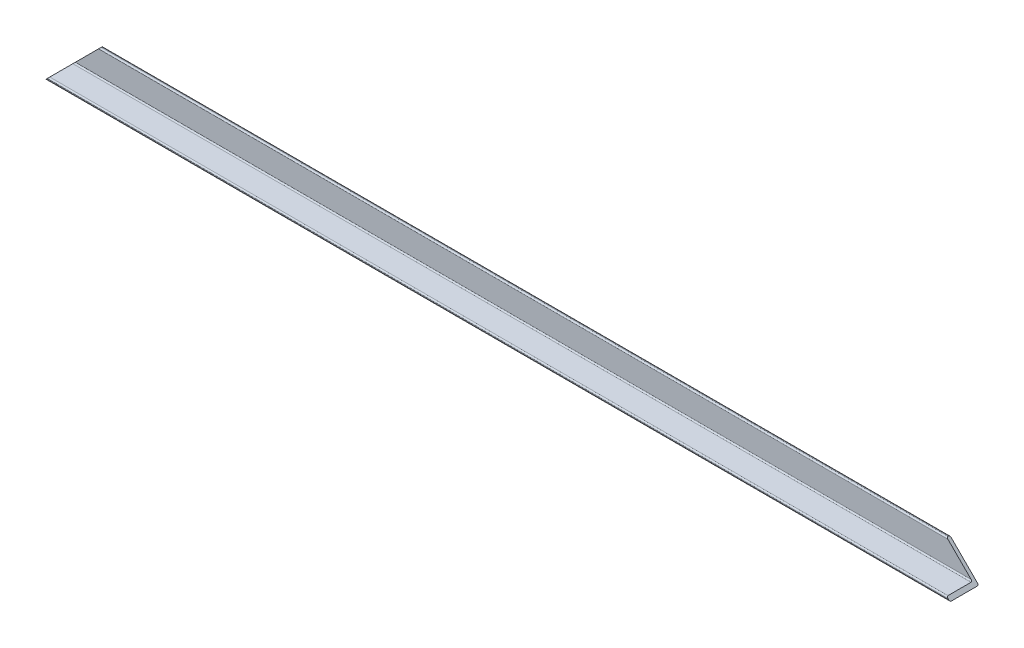
ISO-10303-21;
HEADER;
FILE_DESCRIPTION(('STEP AP214'),'2;1');
FILE_NAME('part.step','',(''),(''),'','','');
FILE_SCHEMA(('AUTOMOTIVE_DESIGN { 1 0 10303 214 1 1 1 1 }'));
ENDSEC;
DATA;
#1=APPLICATION_CONTEXT('core data for automotive mechanical design processes');
#2=APPLICATION_PROTOCOL_DEFINITION('international standard','automotive_design',2000,#1);
#3=PRODUCT_CONTEXT('',#1,'mechanical');
#4=PRODUCT('Part','Part','',(#3));
#5=PRODUCT_RELATED_PRODUCT_CATEGORY('part','',(#4));
#6=PRODUCT_DEFINITION_FORMATION('','',#4);
#7=PRODUCT_DEFINITION_CONTEXT('part definition',#1,'design');
#8=PRODUCT_DEFINITION('design','',#6,#7);
#9=PRODUCT_DEFINITION_SHAPE('','',#8);
#10=(LENGTH_UNIT() NAMED_UNIT(*) SI_UNIT(.MILLI.,.METRE.));
#11=(NAMED_UNIT(*) PLANE_ANGLE_UNIT() SI_UNIT($,.RADIAN.));
#12=(NAMED_UNIT(*) SI_UNIT($,.STERADIAN.) SOLID_ANGLE_UNIT());
#13=UNCERTAINTY_MEASURE_WITH_UNIT(LENGTH_MEASURE(1.E-05),#10,'distance_accuracy_value','');
#14=(GEOMETRIC_REPRESENTATION_CONTEXT(3) GLOBAL_UNCERTAINTY_ASSIGNED_CONTEXT((#13)) GLOBAL_UNIT_ASSIGNED_CONTEXT((#10,
#11,#12)) REPRESENTATION_CONTEXT('',''));
#15=CARTESIAN_POINT('',(0.,0.,0.));
#16=DIRECTION('',(0.,0.,1.));
#17=DIRECTION('',(1.,0.,0.));
#18=AXIS2_PLACEMENT_3D('',#15,#16,#17);
#19=CARTESIAN_POINT('',(-360.,2.5,-11.25));
#20=DIRECTION('',(0.,0.,1.));
#21=DIRECTION('',(1.,0.,0.));
#22=AXIS2_PLACEMENT_3D('',#19,#20,#21);
#23=PLANE('',#22);
#24=DIRECTION('',(-0.707106781186543,0.707106781186552,0.));
#25=VECTOR('',#24,1.);
#26=CARTESIAN_POINT('',(-4.99999999999567,357.5,-11.25));
#27=LINE('',#26,#25);
#28=CARTESIAN_POINT('',(351.5,0.99999999999989,-11.25));
#29=VERTEX_POINT('',#28);
#30=CARTESIAN_POINT('',(331.,21.5,-11.25));
#31=VERTEX_POINT('',#30);
#32=EDGE_CURVE('E126',#29,#31,#27,.T.);
#33=ORIENTED_EDGE('',*,*,#32,.F.);
#34=DIRECTION('',(-1.,0.,0.));
#35=VECTOR('',#34,1.);
#36=CARTESIAN_POINT('',(-360.,1.,-11.25));
#37=LINE('',#36,#35);
#38=CARTESIAN_POINT('',(-351.5,0.999999999999998,-11.25));
#39=VERTEX_POINT('',#38);
#40=EDGE_CURVE('E138',#29,#39,#37,.T.);
#41=ORIENTED_EDGE('',*,*,#40,.T.);
#42=DIRECTION('',(-0.707106781186543,-0.707106781186552,0.));
#43=VECTOR('',#42,1.);
#44=CARTESIAN_POINT('',(-355.,-2.49999999999994,-11.25));
#45=LINE('',#44,#43);
#46=CARTESIAN_POINT('',(-331.,21.5,-11.25));
#47=VERTEX_POINT('',#46);
#48=EDGE_CURVE('E221',#47,#39,#45,.T.);
#49=ORIENTED_EDGE('',*,*,#48,.F.);
#50=DIRECTION('',(-1.,0.,0.));
#51=VECTOR('',#50,1.);
#52=CARTESIAN_POINT('',(330.,21.5,-11.25));
#53=LINE('',#52,#51);
#54=EDGE_CURVE('E141',#47,#31,#53,.F.);
#55=ORIENTED_EDGE('',*,*,#54,.T.);
#56=EDGE_LOOP('',(#33,#41,#49,#55));
#57=FACE_BOUND('',#56,.T.);
#58=ADVANCED_FACE('F33',(#57),#23,.F.);
#59=CARTESIAN_POINT('',(-360.,2.5,11.25));
#60=DIRECTION('',(0.,0.,-1.));
#61=DIRECTION('',(-1.,0.,0.));
#62=AXIS2_PLACEMENT_3D('',#59,#60,#61);
#63=PLANE('',#62);
#64=DIRECTION('',(0.707106781186543,0.707106781186552,0.));
#65=VECTOR('',#64,1.);
#66=CARTESIAN_POINT('',(-360.,-7.5,11.25));
#67=LINE('',#66,#65);
#68=CARTESIAN_POINT('',(-351.5,0.999999999999999,11.25));
#69=VERTEX_POINT('',#68);
#70=CARTESIAN_POINT('',(-351.,1.5,11.25));
#71=VERTEX_POINT('',#70);
#72=EDGE_CURVE('E142',#69,#71,#67,.T.);
#73=ORIENTED_EDGE('',*,*,#72,.F.);
#74=DIRECTION('',(1.,0.,0.));
#75=VECTOR('',#74,1.);
#76=CARTESIAN_POINT('',(-360.,1.,11.25));
#77=LINE('',#76,#75);
#78=CARTESIAN_POINT('',(351.5,0.999999999999999,11.25));
#79=VERTEX_POINT('',#78);
#80=EDGE_CURVE('E171',#69,#79,#77,.T.);
#81=ORIENTED_EDGE('',*,*,#80,.T.);
#82=DIRECTION('',(0.707106781186543,-0.707106781186552,0.));
#83=VECTOR('',#82,1.);
#84=CARTESIAN_POINT('',(360.,-7.5,11.25));
#85=LINE('',#84,#83);
#86=CARTESIAN_POINT('',(351.,1.5,11.25));
#87=VERTEX_POINT('',#86);
#88=EDGE_CURVE('E234',#87,#79,#85,.T.);
#89=ORIENTED_EDGE('',*,*,#88,.F.);
#90=DIRECTION('',(1.,0.,0.));
#91=VECTOR('',#90,1.);
#92=CARTESIAN_POINT('',(-350.,1.5,11.25));
#93=LINE('',#92,#91);
#94=EDGE_CURVE('E133',#87,#71,#93,.F.);
#95=ORIENTED_EDGE('',*,*,#94,.T.);
#96=EDGE_LOOP('',(#73,#81,#89,#95));
#97=FACE_BOUND('',#96,.T.);
#98=ADVANCED_FACE('F241',(#97),#63,.F.);
#99=CARTESIAN_POINT('',(0.,2.5,0.));
#100=DIRECTION('',(0.,1.,0.));
#101=DIRECTION('',(0.,0.,1.));
#102=AXIS2_PLACEMENT_3D('',#99,#100,#101);
#103=PLANE('',#102);
#104=DIRECTION('',(0.,0.,1.));
#105=VECTOR('',#104,1.);
#106=CARTESIAN_POINT('',(-350.,2.5,0.));
#107=LINE('',#106,#105);
#108=CARTESIAN_POINT('',(-350.,2.5,-7.75));
#109=VERTEX_POINT('',#108);
#110=CARTESIAN_POINT('',(-350.,2.5,10.25));
#111=VERTEX_POINT('',#110);
#112=EDGE_CURVE('E209',#109,#111,#107,.T.);
#113=ORIENTED_EDGE('',*,*,#112,.T.);
#114=DIRECTION('',(1.,0.,0.));
#115=VECTOR('',#114,1.);
#116=CARTESIAN_POINT('',(350.,2.5,10.25));
#117=LINE('',#116,#115);
#118=CARTESIAN_POINT('',(350.,2.5,10.25));
#119=VERTEX_POINT('',#118);
#120=EDGE_CURVE('E175',#111,#119,#117,.T.);
#121=ORIENTED_EDGE('',*,*,#120,.T.);
#122=DIRECTION('',(0.,0.,-1.));
#123=VECTOR('',#122,1.);
#124=CARTESIAN_POINT('',(350.,2.5,0.));
#125=LINE('',#124,#123);
#126=CARTESIAN_POINT('',(350.,2.5,-7.75));
#127=VERTEX_POINT('',#126);
#128=EDGE_CURVE('E190',#119,#127,#125,.T.);
#129=ORIENTED_EDGE('',*,*,#128,.T.);
#130=DIRECTION('',(1.,0.,0.));
#131=VECTOR('',#130,1.);
#132=CARTESIAN_POINT('',(0.,2.5,-7.75));
#133=LINE('',#132,#131);
#134=EDGE_CURVE('E173',#127,#109,#133,.F.);
#135=ORIENTED_EDGE('',*,*,#134,.T.);
#136=EDGE_LOOP('',(#113,#121,#129,#135));
#137=FACE_BOUND('',#136,.T.);
#138=ADVANCED_FACE('F198',(#137),#103,.T.);
#139=CARTESIAN_POINT('',(0.,0.,0.));
#140=DIRECTION('',(0.,1.,0.));
#141=DIRECTION('',(0.,0.,1.));
#142=AXIS2_PLACEMENT_3D('',#139,#140,#141);
#143=PLANE('',#142);
#144=DIRECTION('',(0.,0.,1.));
#145=VECTOR('',#144,1.);
#146=CARTESIAN_POINT('',(-352.5,0.,0.));
#147=LINE('',#146,#145);
#148=CARTESIAN_POINT('',(-352.5,0.,-10.25));
#149=VERTEX_POINT('',#148);
#150=CARTESIAN_POINT('',(-352.5,0.,10.25));
#151=VERTEX_POINT('',#150);
#152=EDGE_CURVE('E214',#149,#151,#147,.T.);
#153=ORIENTED_EDGE('',*,*,#152,.F.);
#154=DIRECTION('',(-1.,0.,0.));
#155=VECTOR('',#154,1.);
#156=CARTESIAN_POINT('',(0.,0.,-10.25));
#157=LINE('',#156,#155);
#158=CARTESIAN_POINT('',(352.5,0.,-10.25));
#159=VERTEX_POINT('',#158);
#160=EDGE_CURVE('E162',#149,#159,#157,.F.);
#161=ORIENTED_EDGE('',*,*,#160,.T.);
#162=DIRECTION('',(0.,0.,-1.));
#163=VECTOR('',#162,1.);
#164=CARTESIAN_POINT('',(352.5,0.,0.));
#165=LINE('',#164,#163);
#166=CARTESIAN_POINT('',(352.5,0.,10.25));
#167=VERTEX_POINT('',#166);
#168=EDGE_CURVE('E129',#167,#159,#165,.T.);
#169=ORIENTED_EDGE('',*,*,#168,.F.);
#170=DIRECTION('',(1.,0.,0.));
#171=VECTOR('',#170,1.);
#172=CARTESIAN_POINT('',(0.,0.,10.25));
#173=LINE('',#172,#171);
#174=EDGE_CURVE('E160',#167,#151,#173,.F.);
#175=ORIENTED_EDGE('',*,*,#174,.T.);
#176=EDGE_LOOP('',(#153,#161,#169,#175));
#177=FACE_BOUND('',#176,.T.);
#178=ADVANCED_FACE('F249',(#177),#143,.F.);
#179=CARTESIAN_POINT('',(-360.,22.5,-8.75));
#180=DIRECTION('',(0.,0.,-1.));
#181=DIRECTION('',(-1.,0.,0.));
#182=AXIS2_PLACEMENT_3D('',#179,#180,#181);
#183=PLANE('',#182);
#184=DIRECTION('',(0.707106781186543,-0.707106781186552,0.));
#185=VECTOR('',#184,1.);
#186=CARTESIAN_POINT('',(-14.9999999999957,367.5,-8.75));
#187=LINE('',#186,#185);
#188=CARTESIAN_POINT('',(331.,21.5,-8.75));
#189=VERTEX_POINT('',#188);
#190=CARTESIAN_POINT('',(349.,3.49999999999995,-8.75));
#191=VERTEX_POINT('',#190);
#192=EDGE_CURVE('E192',#189,#191,#187,.T.);
#193=ORIENTED_EDGE('',*,*,#192,.F.);
#194=DIRECTION('',(1.,0.,0.));
#195=VECTOR('',#194,1.);
#196=CARTESIAN_POINT('',(-330.,21.5,-8.75));
#197=LINE('',#196,#195);
#198=CARTESIAN_POINT('',(-331.,21.5,-8.75));
#199=VERTEX_POINT('',#198);
#200=EDGE_CURVE('E187',#189,#199,#197,.F.);
#201=ORIENTED_EDGE('',*,*,#200,.T.);
#202=DIRECTION('',(0.707106781186543,0.707106781186552,0.));
#203=VECTOR('',#202,1.);
#204=CARTESIAN_POINT('',(-345.,7.50000000000018,-8.75));
#205=LINE('',#204,#203);
#206=CARTESIAN_POINT('',(-349.,3.50000000000001,-8.75));
#207=VERTEX_POINT('',#206);
#208=EDGE_CURVE('E207',#207,#199,#205,.T.);
#209=ORIENTED_EDGE('',*,*,#208,.F.);
#210=DIRECTION('',(1.,0.,0.));
#211=VECTOR('',#210,1.);
#212=CARTESIAN_POINT('',(-360.,3.5,-8.75));
#213=LINE('',#212,#211);
#214=EDGE_CURVE('E184',#207,#191,#213,.T.);
#215=ORIENTED_EDGE('',*,*,#214,.T.);
#216=EDGE_LOOP('',(#193,#201,#209,#215));
#217=FACE_BOUND('',#216,.T.);
#218=ADVANCED_FACE('F211',(#217),#183,.F.);
#219=CARTESIAN_POINT('',(0.,22.5,0.));
#220=DIRECTION('',(0.,1.,0.));
#221=DIRECTION('',(0.,0.,1.));
#222=AXIS2_PLACEMENT_3D('',#219,#220,#221);
#223=PLANE('',#222);
#224=DIRECTION('',(0.,0.,-1.));
#225=VECTOR('',#224,1.);
#226=CARTESIAN_POINT('',(330.,22.5,11.25));
#227=LINE('',#226,#225);
#228=CARTESIAN_POINT('',(330.,22.5,-9.75));
#229=VERTEX_POINT('',#228);
#230=CARTESIAN_POINT('',(330.,22.5,-10.25));
#231=VERTEX_POINT('',#230);
#232=EDGE_CURVE('E232',#229,#231,#227,.T.);
#233=ORIENTED_EDGE('',*,*,#232,.T.);
#234=DIRECTION('',(-1.,0.,0.));
#235=VECTOR('',#234,1.);
#236=CARTESIAN_POINT('',(-330.,22.5,-10.25));
#237=LINE('',#236,#235);
#238=CARTESIAN_POINT('',(-330.,22.5,-10.25));
#239=VERTEX_POINT('',#238);
#240=EDGE_CURVE('E181',#231,#239,#237,.T.);
#241=ORIENTED_EDGE('',*,*,#240,.T.);
#242=DIRECTION('',(0.,0.,1.));
#243=VECTOR('',#242,1.);
#244=CARTESIAN_POINT('',(-330.,22.5,0.));
#245=LINE('',#244,#243);
#246=CARTESIAN_POINT('',(-330.,22.5,-9.75));
#247=VERTEX_POINT('',#246);
#248=EDGE_CURVE('E150',#239,#247,#245,.T.);
#249=ORIENTED_EDGE('',*,*,#248,.T.);
#250=DIRECTION('',(1.,0.,0.));
#251=VECTOR('',#250,1.);
#252=CARTESIAN_POINT('',(330.,22.5,-9.75));
#253=LINE('',#252,#251);
#254=EDGE_CURVE('E178',#247,#229,#253,.T.);
#255=ORIENTED_EDGE('',*,*,#254,.T.);
#256=EDGE_LOOP('',(#233,#241,#249,#255));
#257=FACE_BOUND('',#256,.T.);
#258=ADVANCED_FACE('F227',(#257),#223,.T.);
#259=CARTESIAN_POINT('',(-360.,-7.5,11.25));
#260=DIRECTION('',(-0.707106781186552,0.707106781186543,0.));
#261=DIRECTION('',(-0.707106781186543,-0.707106781186552,0.));
#262=AXIS2_PLACEMENT_3D('',#259,#260,#261);
#263=PLANE('',#262);
#264=ORIENTED_EDGE('',*,*,#48,.T.);
#265=CARTESIAN_POINT('',(-351.5,1.,-10.25));
#266=DIRECTION('',(-0.707106781186552,0.707106781186543,0.));
#267=DIRECTION('',(-0.707106781186543,-0.707106781186552,0.));
#268=AXIS2_PLACEMENT_3D('',#265,#266,#267);
#269=ELLIPSE('',#268,1.41421356237309,1.);
#270=EDGE_CURVE('E145',#39,#149,#269,.T.);
#271=ORIENTED_EDGE('',*,*,#270,.T.);
#272=ORIENTED_EDGE('',*,*,#152,.T.);
#273=CARTESIAN_POINT('',(-351.5,1.,10.25));
#274=DIRECTION('',(-0.707106781186552,0.707106781186543,0.));
#275=DIRECTION('',(0.707106781186543,0.707106781186552,0.));
#276=AXIS2_PLACEMENT_3D('',#273,#274,#275);
#277=ELLIPSE('',#276,1.41421356237309,1.);
#278=EDGE_CURVE('E157',#151,#69,#277,.T.);
#279=ORIENTED_EDGE('',*,*,#278,.T.);
#280=ORIENTED_EDGE('',*,*,#72,.T.);
#281=CARTESIAN_POINT('',(-351.,1.5,10.25));
#282=DIRECTION('',(-0.707106781186552,0.707106781186543,0.));
#283=DIRECTION('',(-0.707106781186543,-0.707106781186552,0.));
#284=AXIS2_PLACEMENT_3D('',#281,#282,#283);
#285=ELLIPSE('',#284,1.41421356237309,1.);
#286=EDGE_CURVE('E155',#71,#111,#285,.T.);
#287=ORIENTED_EDGE('',*,*,#286,.T.);
#288=ORIENTED_EDGE('',*,*,#112,.F.);
#289=CARTESIAN_POINT('',(-349.,3.5,-7.75));
#290=DIRECTION('',(-0.707106781186552,0.707106781186543,0.));
#291=DIRECTION('',(0.707106781186543,0.707106781186552,0.));
#292=AXIS2_PLACEMENT_3D('',#289,#290,#291);
#293=ELLIPSE('',#292,1.41421356237309,1.);
#294=EDGE_CURVE('E11',#109,#207,#293,.F.);
#295=ORIENTED_EDGE('',*,*,#294,.T.);
#296=ORIENTED_EDGE('',*,*,#208,.T.);
#297=CARTESIAN_POINT('',(-331.,21.5,-9.75));
#298=DIRECTION('',(-0.707106781186552,0.707106781186543,0.));
#299=DIRECTION('',(-0.707106781186543,-0.707106781186552,0.));
#300=AXIS2_PLACEMENT_3D('',#297,#298,#299);
#301=ELLIPSE('',#300,1.41421356237309,1.);
#302=EDGE_CURVE('E146',#199,#247,#301,.T.);
#303=ORIENTED_EDGE('',*,*,#302,.T.);
#304=ORIENTED_EDGE('',*,*,#248,.F.);
#305=CARTESIAN_POINT('',(-331.,21.5,-10.25));
#306=DIRECTION('',(-0.707106781186552,0.707106781186543,0.));
#307=DIRECTION('',(0.707106781186543,0.707106781186552,0.));
#308=AXIS2_PLACEMENT_3D('',#305,#306,#307);
#309=ELLIPSE('',#308,1.41421356237309,1.);
#310=EDGE_CURVE('E148',#239,#47,#309,.T.);
#311=ORIENTED_EDGE('',*,*,#310,.T.);
#312=EDGE_LOOP('',(#264,#271,#272,#279,#280,#287,#288,#295,#296,#303,#304,#311));
#313=FACE_BOUND('',#312,.T.);
#314=ADVANCED_FACE('F206',(#313),#263,.T.);
#315=CARTESIAN_POINT('',(360.,-7.5,11.25));
#316=DIRECTION('',(0.707106781186552,0.707106781186543,0.));
#317=DIRECTION('',(-0.707106781186543,0.707106781186552,0.));
#318=AXIS2_PLACEMENT_3D('',#315,#316,#317);
#319=PLANE('',#318);
#320=ORIENTED_EDGE('',*,*,#168,.T.);
#321=CARTESIAN_POINT('',(351.5,1.,-10.25));
#322=DIRECTION('',(0.707106781186552,0.707106781186543,0.));
#323=DIRECTION('',(-0.707106781186543,0.707106781186552,0.));
#324=AXIS2_PLACEMENT_3D('',#321,#322,#323);
#325=ELLIPSE('',#324,1.41421356237309,1.);
#326=EDGE_CURVE('E123',#159,#29,#325,.T.);
#327=ORIENTED_EDGE('',*,*,#326,.T.);
#328=ORIENTED_EDGE('',*,*,#32,.T.);
#329=CARTESIAN_POINT('',(331.,21.5,-10.25));
#330=DIRECTION('',(0.707106781186552,0.707106781186543,0.));
#331=DIRECTION('',(0.707106781186543,-0.707106781186552,0.));
#332=AXIS2_PLACEMENT_3D('',#329,#330,#331);
#333=ELLIPSE('',#332,1.41421356237309,1.);
#334=EDGE_CURVE('E166',#31,#231,#333,.T.);
#335=ORIENTED_EDGE('',*,*,#334,.T.);
#336=ORIENTED_EDGE('',*,*,#232,.F.);
#337=CARTESIAN_POINT('',(331.,21.5,-9.75));
#338=DIRECTION('',(0.707106781186552,0.707106781186543,0.));
#339=DIRECTION('',(-0.707106781186543,0.707106781186552,0.));
#340=AXIS2_PLACEMENT_3D('',#337,#338,#339);
#341=ELLIPSE('',#340,1.41421356237309,1.);
#342=EDGE_CURVE('E164',#229,#189,#341,.T.);
#343=ORIENTED_EDGE('',*,*,#342,.T.);
#344=ORIENTED_EDGE('',*,*,#192,.T.);
#345=CARTESIAN_POINT('',(349.,3.5,-7.75));
#346=DIRECTION('',(0.707106781186552,0.707106781186543,0.));
#347=DIRECTION('',(0.707106781186543,-0.707106781186552,0.));
#348=AXIS2_PLACEMENT_3D('',#345,#346,#347);
#349=ELLIPSE('',#348,1.41421356237309,1.);
#350=EDGE_CURVE('E41',#191,#127,#349,.F.);
#351=ORIENTED_EDGE('',*,*,#350,.T.);
#352=ORIENTED_EDGE('',*,*,#128,.F.);
#353=CARTESIAN_POINT('',(351.,1.5,10.25));
#354=DIRECTION('',(0.707106781186552,0.707106781186543,0.));
#355=DIRECTION('',(-0.707106781186543,0.707106781186552,0.));
#356=AXIS2_PLACEMENT_3D('',#353,#354,#355);
#357=ELLIPSE('',#356,1.41421356237309,1.);
#358=EDGE_CURVE('E56',#119,#87,#357,.T.);
#359=ORIENTED_EDGE('',*,*,#358,.T.);
#360=ORIENTED_EDGE('',*,*,#88,.T.);
#361=CARTESIAN_POINT('',(351.5,1.,10.25));
#362=DIRECTION('',(0.707106781186552,0.707106781186543,0.));
#363=DIRECTION('',(0.707106781186543,-0.707106781186552,0.));
#364=AXIS2_PLACEMENT_3D('',#361,#362,#363);
#365=ELLIPSE('',#364,1.41421356237309,1.);
#366=EDGE_CURVE('E48',#79,#167,#365,.T.);
#367=ORIENTED_EDGE('',*,*,#366,.T.);
#368=EDGE_LOOP('',(#320,#327,#328,#335,#336,#343,#344,#351,#352,#359,#360,#367));
#369=FACE_BOUND('',#368,.T.);
#370=ADVANCED_FACE('F125',(#369),#319,.T.);
#371=CARTESIAN_POINT('',(-360.,1.,-10.25));
#372=DIRECTION('',(-1.,0.,0.));
#373=DIRECTION('',(0.,0.,1.));
#374=AXIS2_PLACEMENT_3D('',#371,#372,#373);
#375=CYLINDRICAL_SURFACE('',#374,1.);
#376=ORIENTED_EDGE('',*,*,#326,.F.);
#377=ORIENTED_EDGE('',*,*,#160,.F.);
#378=ORIENTED_EDGE('',*,*,#270,.F.);
#379=ORIENTED_EDGE('',*,*,#40,.F.);
#380=EDGE_LOOP('',(#376,#377,#378,#379));
#381=FACE_BOUND('',#380,.T.);
#382=ADVANCED_FACE('F144',(#381),#375,.T.);
#383=CARTESIAN_POINT('',(-360.,1.,10.25));
#384=DIRECTION('',(1.,0.,0.));
#385=DIRECTION('',(0.,0.,-1.));
#386=AXIS2_PLACEMENT_3D('',#383,#384,#385);
#387=CYLINDRICAL_SURFACE('',#386,1.);
#388=ORIENTED_EDGE('',*,*,#278,.F.);
#389=ORIENTED_EDGE('',*,*,#174,.F.);
#390=ORIENTED_EDGE('',*,*,#366,.F.);
#391=ORIENTED_EDGE('',*,*,#80,.F.);
#392=EDGE_LOOP('',(#388,#389,#390,#391));
#393=FACE_BOUND('',#392,.T.);
#394=ADVANCED_FACE('F246',(#393),#387,.T.);
#395=CARTESIAN_POINT('',(0.,1.5,10.25));
#396=DIRECTION('',(-1.,0.,0.));
#397=DIRECTION('',(0.,0.,1.));
#398=AXIS2_PLACEMENT_3D('',#395,#396,#397);
#399=CYLINDRICAL_SURFACE('',#398,1.);
#400=ORIENTED_EDGE('',*,*,#286,.F.);
#401=ORIENTED_EDGE('',*,*,#94,.F.);
#402=ORIENTED_EDGE('',*,*,#358,.F.);
#403=ORIENTED_EDGE('',*,*,#120,.F.);
#404=EDGE_LOOP('',(#400,#401,#402,#403));
#405=FACE_BOUND('',#404,.T.);
#406=ADVANCED_FACE('F244',(#405),#399,.T.);
#407=CARTESIAN_POINT('',(0.,21.5,-10.25));
#408=DIRECTION('',(1.,0.,0.));
#409=DIRECTION('',(0.,0.,-1.));
#410=AXIS2_PLACEMENT_3D('',#407,#408,#409);
#411=CYLINDRICAL_SURFACE('',#410,1.);
#412=ORIENTED_EDGE('',*,*,#334,.F.);
#413=ORIENTED_EDGE('',*,*,#54,.F.);
#414=ORIENTED_EDGE('',*,*,#310,.F.);
#415=ORIENTED_EDGE('',*,*,#240,.F.);
#416=EDGE_LOOP('',(#412,#413,#414,#415));
#417=FACE_BOUND('',#416,.T.);
#418=ADVANCED_FACE('F251',(#417),#411,.T.);
#419=CARTESIAN_POINT('',(0.,21.5,-9.75));
#420=DIRECTION('',(-1.,0.,0.));
#421=DIRECTION('',(0.,0.,1.));
#422=AXIS2_PLACEMENT_3D('',#419,#420,#421);
#423=CYLINDRICAL_SURFACE('',#422,1.);
#424=ORIENTED_EDGE('',*,*,#302,.F.);
#425=ORIENTED_EDGE('',*,*,#200,.F.);
#426=ORIENTED_EDGE('',*,*,#342,.F.);
#427=ORIENTED_EDGE('',*,*,#254,.F.);
#428=EDGE_LOOP('',(#424,#425,#426,#427));
#429=FACE_BOUND('',#428,.T.);
#430=ADVANCED_FACE('F231',(#429),#423,.T.);
#431=CARTESIAN_POINT('',(-360.,3.5,-7.75));
#432=DIRECTION('',(1.,0.,0.));
#433=DIRECTION('',(0.,0.,-1.));
#434=AXIS2_PLACEMENT_3D('',#431,#432,#433);
#435=CYLINDRICAL_SURFACE('',#434,1.);
#436=ORIENTED_EDGE('',*,*,#294,.F.);
#437=ORIENTED_EDGE('',*,*,#134,.F.);
#438=ORIENTED_EDGE('',*,*,#350,.F.);
#439=ORIENTED_EDGE('',*,*,#214,.F.);
#440=EDGE_LOOP('',(#436,#437,#438,#439));
#441=FACE_BOUND('',#440,.T.);
#442=ADVANCED_FACE('F35',(#441),#435,.F.);
#443=CLOSED_SHELL('',(#58,#98,#138,#178,#218,#258,#314,#370,#382,#394,#406,#418,#430,#442));
#444=MANIFOLD_SOLID_BREP('B2',#443);
#445=ADVANCED_BREP_SHAPE_REPRESENTATION('',(#18,#444),#14);
#446=SHAPE_DEFINITION_REPRESENTATION(#9,#445);
ENDSEC;
END-ISO-10303-21;
